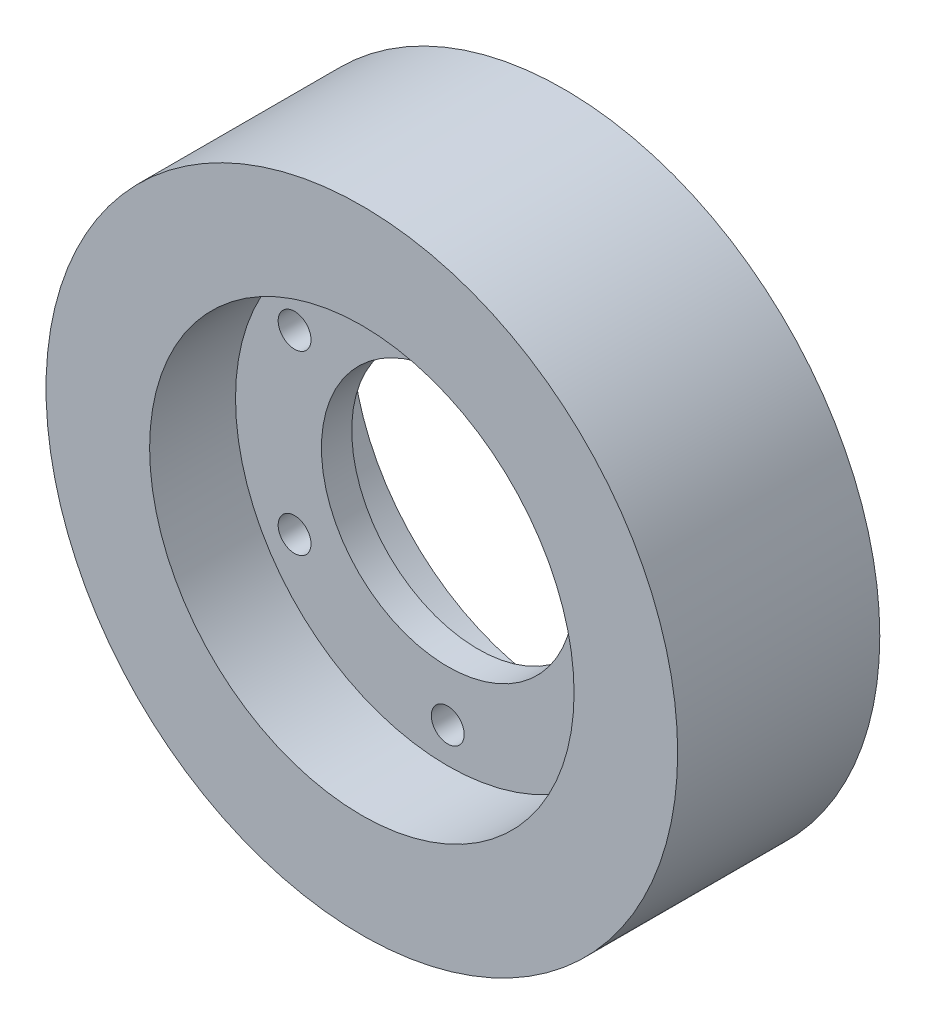
ISO-10303-21;
HEADER;
FILE_DESCRIPTION(('STEP AP214'),'2;1');
FILE_NAME('part.step','',(''),(''),'','','');
FILE_SCHEMA(('AUTOMOTIVE_DESIGN { 1 0 10303 214 1 1 1 1 }'));
ENDSEC;
DATA;
#1=APPLICATION_CONTEXT('core data for automotive mechanical design processes');
#2=APPLICATION_PROTOCOL_DEFINITION('international standard','automotive_design',2000,#1);
#3=PRODUCT_CONTEXT('',#1,'mechanical');
#4=PRODUCT('Part','Part','',(#3));
#5=PRODUCT_RELATED_PRODUCT_CATEGORY('part','',(#4));
#6=PRODUCT_DEFINITION_FORMATION('','',#4);
#7=PRODUCT_DEFINITION_CONTEXT('part definition',#1,'design');
#8=PRODUCT_DEFINITION('design','',#6,#7);
#9=PRODUCT_DEFINITION_SHAPE('','',#8);
#10=(LENGTH_UNIT() NAMED_UNIT(*) SI_UNIT(.MILLI.,.METRE.));
#11=(NAMED_UNIT(*) PLANE_ANGLE_UNIT() SI_UNIT($,.RADIAN.));
#12=(NAMED_UNIT(*) SI_UNIT($,.STERADIAN.) SOLID_ANGLE_UNIT());
#13=UNCERTAINTY_MEASURE_WITH_UNIT(LENGTH_MEASURE(1.E-05),#10,'distance_accuracy_value','');
#14=(GEOMETRIC_REPRESENTATION_CONTEXT(3) GLOBAL_UNCERTAINTY_ASSIGNED_CONTEXT((#13)) GLOBAL_UNIT_ASSIGNED_CONTEXT((#10,
#11,#12)) REPRESENTATION_CONTEXT('',''));
#15=CARTESIAN_POINT('',(0.,0.,0.));
#16=DIRECTION('',(0.,0.,1.));
#17=DIRECTION('',(1.,0.,0.));
#18=AXIS2_PLACEMENT_3D('',#15,#16,#17);
#19=CARTESIAN_POINT('',(0.,0.,6.));
#20=DIRECTION('',(0.,0.,1.));
#21=DIRECTION('',(1.,0.,0.));
#22=AXIS2_PLACEMENT_3D('',#19,#20,#21);
#23=PLANE('',#22);
#24=CARTESIAN_POINT('',(-30.3108891324524,-17.5000000000017,6.));
#25=DIRECTION('',(0.,0.,1.));
#26=DIRECTION('',(1.,0.,0.));
#27=AXIS2_PLACEMENT_3D('',#24,#25,#26);
#28=CIRCLE('',#27,3.25000000000366);
#29=CARTESIAN_POINT('',(-27.0608891324487,-17.5000000000017,6.));
#30=VERTEX_POINT('',#29);
#31=EDGE_CURVE('E72',#30,#30,#28,.T.);
#32=ORIENTED_EDGE('',*,*,#31,.F.);
#33=EDGE_LOOP('',(#32));
#34=FACE_BOUND('',#33,.T.);
#35=CARTESIAN_POINT('',(30.3108891324583,-17.4999999999983,6.));
#36=DIRECTION('',(0.,0.,1.));
#37=DIRECTION('',(1.,0.,0.));
#38=AXIS2_PLACEMENT_3D('',#35,#36,#37);
#39=CIRCLE('',#38,3.25000000000251);
#40=CARTESIAN_POINT('',(33.5608891324608,-17.4999999999983,6.));
#41=VERTEX_POINT('',#40);
#42=EDGE_CURVE('E60',#41,#41,#39,.T.);
#43=ORIENTED_EDGE('',*,*,#42,.F.);
#44=EDGE_LOOP('',(#43));
#45=FACE_BOUND('',#44,.T.);
#46=CARTESIAN_POINT('',(0.,35.,6.));
#47=DIRECTION('',(0.,0.,1.));
#48=DIRECTION('',(1.,0.,0.));
#49=AXIS2_PLACEMENT_3D('',#46,#47,#48);
#50=CIRCLE('',#49,3.25);
#51=CARTESIAN_POINT('',(3.25,35.,6.));
#52=VERTEX_POINT('',#51);
#53=EDGE_CURVE('E49',#52,#52,#50,.T.);
#54=ORIENTED_EDGE('',*,*,#53,.F.);
#55=EDGE_LOOP('',(#54));
#56=FACE_BOUND('',#55,.T.);
#57=CARTESIAN_POINT('',(0.,0.,6.));
#58=DIRECTION('',(0.,0.,1.));
#59=DIRECTION('',(1.,0.,0.));
#60=AXIS2_PLACEMENT_3D('',#57,#58,#59);
#61=CIRCLE('',#60,42.);
#62=CARTESIAN_POINT('',(42.,0.,6.));
#63=VERTEX_POINT('',#62);
#64=EDGE_CURVE('E84',#63,#63,#61,.F.);
#65=ORIENTED_EDGE('',*,*,#64,.F.);
#66=EDGE_LOOP('',(#65));
#67=FACE_BOUND('',#66,.T.);
#68=CARTESIAN_POINT('',(0.,0.,6.));
#69=DIRECTION('',(0.,0.,1.));
#70=DIRECTION('',(1.,0.,0.));
#71=AXIS2_PLACEMENT_3D('',#68,#69,#70);
#72=CIRCLE('',#71,25.);
#73=CARTESIAN_POINT('',(25.,0.,6.));
#74=VERTEX_POINT('',#73);
#75=EDGE_CURVE('E40',#74,#74,#72,.T.);
#76=ORIENTED_EDGE('',*,*,#75,.F.);
#77=EDGE_LOOP('',(#76));
#78=FACE_BOUND('',#77,.T.);
#79=CARTESIAN_POINT('',(30.3108891324564,17.5000000000017,6.));
#80=DIRECTION('',(0.,0.,1.));
#81=DIRECTION('',(1.,0.,0.));
#82=AXIS2_PLACEMENT_3D('',#79,#80,#81);
#83=CIRCLE('',#82,3.25000000000053);
#84=CARTESIAN_POINT('',(33.5608891324569,17.5000000000017,6.));
#85=VERTEX_POINT('',#84);
#86=EDGE_CURVE('E54',#85,#85,#83,.T.);
#87=ORIENTED_EDGE('',*,*,#86,.F.);
#88=EDGE_LOOP('',(#87));
#89=FACE_BOUND('',#88,.T.);
#90=CARTESIAN_POINT('',(3.96618052886552E-12,-35.,6.));
#91=DIRECTION('',(0.,0.,1.));
#92=DIRECTION('',(1.,0.,0.));
#93=AXIS2_PLACEMENT_3D('',#90,#91,#92);
#94=CIRCLE('',#93,3.25000000000403);
#95=CARTESIAN_POINT('',(3.25000000000799,-35.,6.));
#96=VERTEX_POINT('',#95);
#97=EDGE_CURVE('E66',#96,#96,#94,.T.);
#98=ORIENTED_EDGE('',*,*,#97,.F.);
#99=EDGE_LOOP('',(#98));
#100=FACE_BOUND('',#99,.T.);
#101=CARTESIAN_POINT('',(-30.3108891324544,17.4999999999983,6.));
#102=DIRECTION('',(0.,0.,1.));
#103=DIRECTION('',(1.,0.,0.));
#104=AXIS2_PLACEMENT_3D('',#101,#102,#103);
#105=CIRCLE('',#104,3.25000000000187);
#106=CARTESIAN_POINT('',(-27.0608891324525,17.4999999999983,6.));
#107=VERTEX_POINT('',#106);
#108=EDGE_CURVE('E78',#107,#107,#105,.T.);
#109=ORIENTED_EDGE('',*,*,#108,.F.);
#110=EDGE_LOOP('',(#109));
#111=FACE_BOUND('',#110,.T.);
#112=ADVANCED_FACE('F33',(#34,#45,#56,#67,#78,#89,#100,#111),#23,.T.);
#113=CARTESIAN_POINT('',(0.,0.,0.));
#114=DIRECTION('',(0.,0.,1.));
#115=DIRECTION('',(1.,0.,0.));
#116=AXIS2_PLACEMENT_3D('',#113,#114,#115);
#117=PLANE('',#116);
#118=CARTESIAN_POINT('',(0.,0.,0.));
#119=DIRECTION('',(0.,0.,1.));
#120=DIRECTION('',(1.,0.,0.));
#121=AXIS2_PLACEMENT_3D('',#118,#119,#120);
#122=CIRCLE('',#121,42.);
#123=CARTESIAN_POINT('',(42.,0.,0.));
#124=VERTEX_POINT('',#123);
#125=EDGE_CURVE('E10',#124,#124,#122,.T.);
#126=ORIENTED_EDGE('',*,*,#125,.F.);
#127=EDGE_LOOP('',(#126));
#128=FACE_BOUND('',#127,.T.);
#129=CARTESIAN_POINT('',(0.,0.,0.));
#130=DIRECTION('',(0.,0.,1.));
#131=DIRECTION('',(1.,0.,0.));
#132=AXIS2_PLACEMENT_3D('',#129,#130,#131);
#133=CIRCLE('',#132,25.);
#134=CARTESIAN_POINT('',(25.,0.,0.));
#135=VERTEX_POINT('',#134);
#136=EDGE_CURVE('E44',#135,#135,#133,.T.);
#137=ORIENTED_EDGE('',*,*,#136,.T.);
#138=EDGE_LOOP('',(#137));
#139=FACE_BOUND('',#138,.T.);
#140=CARTESIAN_POINT('',(0.,35.,0.));
#141=DIRECTION('',(0.,0.,1.));
#142=DIRECTION('',(1.,0.,0.));
#143=AXIS2_PLACEMENT_3D('',#140,#141,#142);
#144=CIRCLE('',#143,3.25);
#145=CARTESIAN_POINT('',(3.25,35.,0.));
#146=VERTEX_POINT('',#145);
#147=EDGE_CURVE('E51',#146,#146,#144,.T.);
#148=ORIENTED_EDGE('',*,*,#147,.T.);
#149=EDGE_LOOP('',(#148));
#150=FACE_BOUND('',#149,.T.);
#151=CARTESIAN_POINT('',(30.3108891324564,17.5000000000017,0.));
#152=DIRECTION('',(0.,0.,1.));
#153=DIRECTION('',(1.,0.,0.));
#154=AXIS2_PLACEMENT_3D('',#151,#152,#153);
#155=CIRCLE('',#154,3.25000000000053);
#156=CARTESIAN_POINT('',(33.5608891324569,17.5000000000017,0.));
#157=VERTEX_POINT('',#156);
#158=EDGE_CURVE('E57',#157,#157,#155,.T.);
#159=ORIENTED_EDGE('',*,*,#158,.T.);
#160=EDGE_LOOP('',(#159));
#161=FACE_BOUND('',#160,.T.);
#162=CARTESIAN_POINT('',(30.3108891324583,-17.4999999999983,0.));
#163=DIRECTION('',(0.,0.,1.));
#164=DIRECTION('',(1.,0.,0.));
#165=AXIS2_PLACEMENT_3D('',#162,#163,#164);
#166=CIRCLE('',#165,3.25000000000251);
#167=CARTESIAN_POINT('',(33.5608891324608,-17.4999999999983,0.));
#168=VERTEX_POINT('',#167);
#169=EDGE_CURVE('E63',#168,#168,#166,.T.);
#170=ORIENTED_EDGE('',*,*,#169,.T.);
#171=EDGE_LOOP('',(#170));
#172=FACE_BOUND('',#171,.T.);
#173=CARTESIAN_POINT('',(3.96618052886552E-12,-35.,0.));
#174=DIRECTION('',(0.,0.,1.));
#175=DIRECTION('',(1.,0.,0.));
#176=AXIS2_PLACEMENT_3D('',#173,#174,#175);
#177=CIRCLE('',#176,3.25000000000403);
#178=CARTESIAN_POINT('',(3.25000000000799,-35.,0.));
#179=VERTEX_POINT('',#178);
#180=EDGE_CURVE('E69',#179,#179,#177,.T.);
#181=ORIENTED_EDGE('',*,*,#180,.T.);
#182=EDGE_LOOP('',(#181));
#183=FACE_BOUND('',#182,.T.);
#184=CARTESIAN_POINT('',(-30.3108891324524,-17.5000000000017,0.));
#185=DIRECTION('',(0.,0.,1.));
#186=DIRECTION('',(1.,0.,0.));
#187=AXIS2_PLACEMENT_3D('',#184,#185,#186);
#188=CIRCLE('',#187,3.25000000000366);
#189=CARTESIAN_POINT('',(-27.0608891324487,-17.5000000000017,0.));
#190=VERTEX_POINT('',#189);
#191=EDGE_CURVE('E75',#190,#190,#188,.T.);
#192=ORIENTED_EDGE('',*,*,#191,.T.);
#193=EDGE_LOOP('',(#192));
#194=FACE_BOUND('',#193,.T.);
#195=CARTESIAN_POINT('',(-30.3108891324544,17.4999999999983,0.));
#196=DIRECTION('',(0.,0.,1.));
#197=DIRECTION('',(1.,0.,0.));
#198=AXIS2_PLACEMENT_3D('',#195,#196,#197);
#199=CIRCLE('',#198,3.25000000000187);
#200=CARTESIAN_POINT('',(-27.0608891324525,17.4999999999983,0.));
#201=VERTEX_POINT('',#200);
#202=EDGE_CURVE('E81',#201,#201,#199,.T.);
#203=ORIENTED_EDGE('',*,*,#202,.T.);
#204=EDGE_LOOP('',(#203));
#205=FACE_BOUND('',#204,.T.);
#206=ADVANCED_FACE('F35',(#128,#139,#150,#161,#172,#183,#194,#205),#117,.F.);
#207=CARTESIAN_POINT('',(0.,0.,6.));
#208=DIRECTION('',(0.,0.,-1.));
#209=DIRECTION('',(-1.,0.,0.));
#210=AXIS2_PLACEMENT_3D('',#207,#208,#209);
#211=CYLINDRICAL_SURFACE('',#210,25.);
#212=ORIENTED_EDGE('',*,*,#75,.T.);
#213=EDGE_LOOP('',(#212));
#214=FACE_BOUND('',#213,.T.);
#215=ORIENTED_EDGE('',*,*,#136,.F.);
#216=EDGE_LOOP('',(#215));
#217=FACE_BOUND('',#216,.T.);
#218=ADVANCED_FACE('F125',(#214,#217),#211,.F.);
#219=CARTESIAN_POINT('',(0.,35.,6.));
#220=DIRECTION('',(0.,0.,-1.));
#221=DIRECTION('',(-1.,0.,0.));
#222=AXIS2_PLACEMENT_3D('',#219,#220,#221);
#223=CYLINDRICAL_SURFACE('',#222,3.25);
#224=ORIENTED_EDGE('',*,*,#53,.T.);
#225=EDGE_LOOP('',(#224));
#226=FACE_BOUND('',#225,.T.);
#227=ORIENTED_EDGE('',*,*,#147,.F.);
#228=EDGE_LOOP('',(#227));
#229=FACE_BOUND('',#228,.T.);
#230=ADVANCED_FACE('F132',(#226,#229),#223,.F.);
#231=CARTESIAN_POINT('',(30.3108891324564,17.5000000000017,6.));
#232=DIRECTION('',(0.,0.,-1.));
#233=DIRECTION('',(-1.,0.,0.));
#234=AXIS2_PLACEMENT_3D('',#231,#232,#233);
#235=CYLINDRICAL_SURFACE('',#234,3.25000000000053);
#236=ORIENTED_EDGE('',*,*,#86,.T.);
#237=EDGE_LOOP('',(#236));
#238=FACE_BOUND('',#237,.T.);
#239=ORIENTED_EDGE('',*,*,#158,.F.);
#240=EDGE_LOOP('',(#239));
#241=FACE_BOUND('',#240,.T.);
#242=ADVANCED_FACE('F135',(#238,#241),#235,.F.);
#243=CARTESIAN_POINT('',(30.3108891324583,-17.4999999999983,6.));
#244=DIRECTION('',(0.,0.,-1.));
#245=DIRECTION('',(-1.,0.,0.));
#246=AXIS2_PLACEMENT_3D('',#243,#244,#245);
#247=CYLINDRICAL_SURFACE('',#246,3.25000000000251);
#248=ORIENTED_EDGE('',*,*,#42,.T.);
#249=EDGE_LOOP('',(#248));
#250=FACE_BOUND('',#249,.T.);
#251=ORIENTED_EDGE('',*,*,#169,.F.);
#252=EDGE_LOOP('',(#251));
#253=FACE_BOUND('',#252,.T.);
#254=ADVANCED_FACE('F139',(#250,#253),#247,.F.);
#255=CARTESIAN_POINT('',(3.96618052886552E-12,-35.,6.));
#256=DIRECTION('',(0.,0.,-1.));
#257=DIRECTION('',(-1.,0.,0.));
#258=AXIS2_PLACEMENT_3D('',#255,#256,#257);
#259=CYLINDRICAL_SURFACE('',#258,3.25000000000403);
#260=ORIENTED_EDGE('',*,*,#97,.T.);
#261=EDGE_LOOP('',(#260));
#262=FACE_BOUND('',#261,.T.);
#263=ORIENTED_EDGE('',*,*,#180,.F.);
#264=EDGE_LOOP('',(#263));
#265=FACE_BOUND('',#264,.T.);
#266=ADVANCED_FACE('F143',(#262,#265),#259,.F.);
#267=CARTESIAN_POINT('',(-30.3108891324524,-17.5000000000017,6.));
#268=DIRECTION('',(0.,0.,-1.));
#269=DIRECTION('',(-1.,0.,0.));
#270=AXIS2_PLACEMENT_3D('',#267,#268,#269);
#271=CYLINDRICAL_SURFACE('',#270,3.25000000000366);
#272=ORIENTED_EDGE('',*,*,#31,.T.);
#273=EDGE_LOOP('',(#272));
#274=FACE_BOUND('',#273,.T.);
#275=ORIENTED_EDGE('',*,*,#191,.F.);
#276=EDGE_LOOP('',(#275));
#277=FACE_BOUND('',#276,.T.);
#278=ADVANCED_FACE('F147',(#274,#277),#271,.F.);
#279=CARTESIAN_POINT('',(-30.3108891324544,17.4999999999983,6.));
#280=DIRECTION('',(0.,0.,-1.));
#281=DIRECTION('',(-1.,0.,0.));
#282=AXIS2_PLACEMENT_3D('',#279,#280,#281);
#283=CYLINDRICAL_SURFACE('',#282,3.25000000000187);
#284=ORIENTED_EDGE('',*,*,#108,.T.);
#285=EDGE_LOOP('',(#284));
#286=FACE_BOUND('',#285,.T.);
#287=ORIENTED_EDGE('',*,*,#202,.F.);
#288=EDGE_LOOP('',(#287));
#289=FACE_BOUND('',#288,.T.);
#290=ADVANCED_FACE('F117',(#286,#289),#283,.F.);
#291=CARTESIAN_POINT('',(0.,0.,23.));
#292=DIRECTION('',(0.,0.,-1.));
#293=DIRECTION('',(-1.,0.,0.));
#294=AXIS2_PLACEMENT_3D('',#291,#292,#293);
#295=CYLINDRICAL_SURFACE('',#294,42.);
#296=CARTESIAN_POINT('',(0.,0.,-17.));
#297=DIRECTION('',(0.,0.,1.));
#298=DIRECTION('',(1.,0.,0.));
#299=AXIS2_PLACEMENT_3D('',#296,#297,#298);
#300=CIRCLE('',#299,42.);
#301=CARTESIAN_POINT('',(42.,0.,-17.));
#302=VERTEX_POINT('',#301);
#303=EDGE_CURVE('E96',#302,#302,#300,.T.);
#304=ORIENTED_EDGE('',*,*,#303,.F.);
#305=EDGE_LOOP('',(#304));
#306=FACE_BOUND('',#305,.T.);
#307=ORIENTED_EDGE('',*,*,#125,.T.);
#308=EDGE_LOOP('',(#307));
#309=FACE_BOUND('',#308,.T.);
#310=ADVANCED_FACE('F107',(#306,#309),#295,.F.);
#311=CARTESIAN_POINT('',(0.,0.,23.));
#312=DIRECTION('',(0.,0.,1.));
#313=DIRECTION('',(1.,0.,0.));
#314=AXIS2_PLACEMENT_3D('',#311,#312,#313);
#315=PLANE('',#314);
#316=CARTESIAN_POINT('',(0.,0.,23.));
#317=DIRECTION('',(0.,0.,1.));
#318=DIRECTION('',(1.,0.,0.));
#319=AXIS2_PLACEMENT_3D('',#316,#317,#318);
#320=CIRCLE('',#319,62.5);
#321=CARTESIAN_POINT('',(62.5,0.,23.));
#322=VERTEX_POINT('',#321);
#323=EDGE_CURVE('E89',#322,#322,#320,.T.);
#324=ORIENTED_EDGE('',*,*,#323,.T.);
#325=EDGE_LOOP('',(#324));
#326=FACE_BOUND('',#325,.T.);
#327=CARTESIAN_POINT('',(0.,0.,23.));
#328=DIRECTION('',(0.,0.,1.));
#329=DIRECTION('',(1.,0.,0.));
#330=AXIS2_PLACEMENT_3D('',#327,#328,#329);
#331=CIRCLE('',#330,42.);
#332=CARTESIAN_POINT('',(42.,0.,23.));
#333=VERTEX_POINT('',#332);
#334=EDGE_CURVE('E93',#333,#333,#331,.T.);
#335=ORIENTED_EDGE('',*,*,#334,.F.);
#336=EDGE_LOOP('',(#335));
#337=FACE_BOUND('',#336,.T.);
#338=ADVANCED_FACE('F104',(#326,#337),#315,.T.);
#339=CARTESIAN_POINT('',(0.,0.,-17.));
#340=DIRECTION('',(0.,0.,1.));
#341=DIRECTION('',(1.,0.,0.));
#342=AXIS2_PLACEMENT_3D('',#339,#340,#341);
#343=PLANE('',#342);
#344=CARTESIAN_POINT('',(0.,0.,-17.));
#345=DIRECTION('',(0.,0.,1.));
#346=DIRECTION('',(1.,0.,0.));
#347=AXIS2_PLACEMENT_3D('',#344,#345,#346);
#348=CIRCLE('',#347,62.5);
#349=CARTESIAN_POINT('',(62.5,0.,-17.));
#350=VERTEX_POINT('',#349);
#351=EDGE_CURVE('E90',#350,#350,#348,.T.);
#352=ORIENTED_EDGE('',*,*,#351,.F.);
#353=EDGE_LOOP('',(#352));
#354=FACE_BOUND('',#353,.T.);
#355=ORIENTED_EDGE('',*,*,#303,.T.);
#356=EDGE_LOOP('',(#355));
#357=FACE_BOUND('',#356,.T.);
#358=ADVANCED_FACE('F106',(#354,#357),#343,.F.);
#359=CARTESIAN_POINT('',(0.,0.,23.));
#360=DIRECTION('',(0.,0.,-1.));
#361=DIRECTION('',(-1.,0.,0.));
#362=AXIS2_PLACEMENT_3D('',#359,#360,#361);
#363=CYLINDRICAL_SURFACE('',#362,62.5);
#364=ORIENTED_EDGE('',*,*,#323,.F.);
#365=EDGE_LOOP('',(#364));
#366=FACE_BOUND('',#365,.T.);
#367=ORIENTED_EDGE('',*,*,#351,.T.);
#368=EDGE_LOOP('',(#367));
#369=FACE_BOUND('',#368,.T.);
#370=ADVANCED_FACE('F114',(#366,#369),#363,.T.);
#371=ORIENTED_EDGE('',*,*,#64,.T.);
#372=EDGE_LOOP('',(#371));
#373=FACE_BOUND('',#372,.T.);
#374=ORIENTED_EDGE('',*,*,#334,.T.);
#375=EDGE_LOOP('',(#374));
#376=FACE_BOUND('',#375,.T.);
#377=ADVANCED_FACE('F102',(#373,#376),#295,.F.);
#378=CLOSED_SHELL('',(#112,#206,#218,#230,#242,#254,#266,#278,#290,#310,#338,#358,#370,#377));
#379=MANIFOLD_SOLID_BREP('B2',#378);
#380=ADVANCED_BREP_SHAPE_REPRESENTATION('',(#18,#379),#14);
#381=SHAPE_DEFINITION_REPRESENTATION(#9,#380);
ENDSEC;
END-ISO-10303-21;
